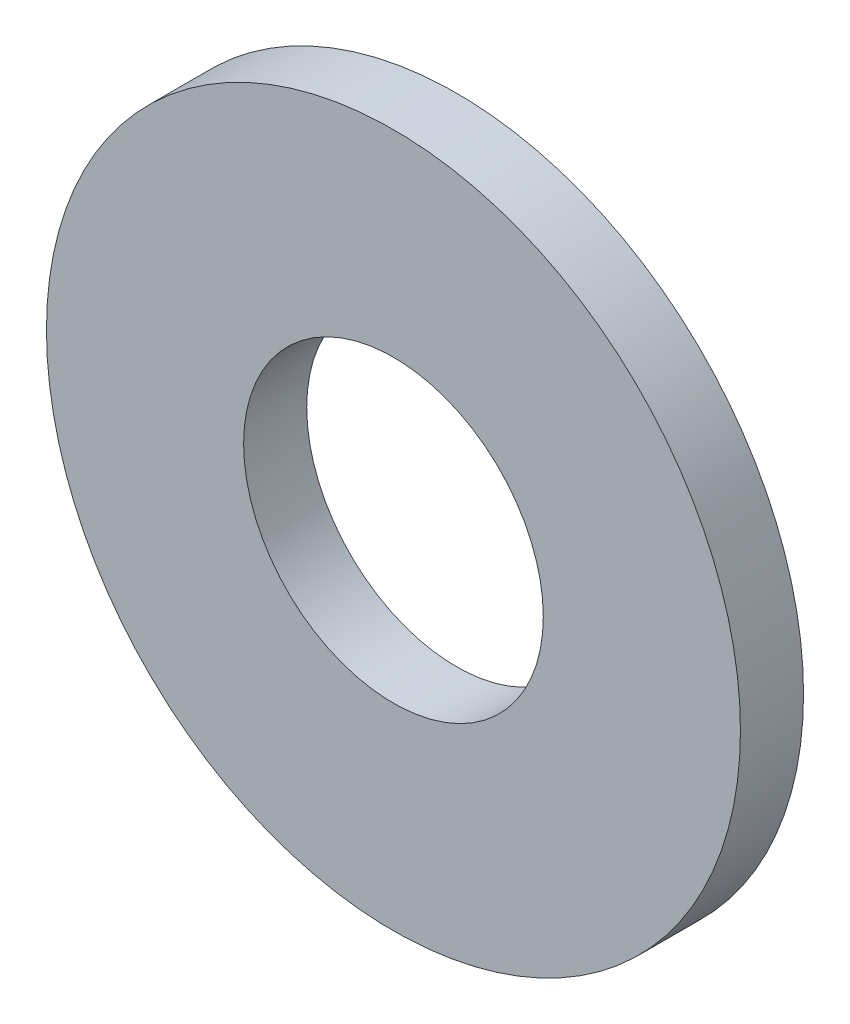
ISO-10303-21;
HEADER;
FILE_DESCRIPTION(('STEP AP214'),'2;1');
FILE_NAME('part.step','',(''),(''),'','','');
FILE_SCHEMA(('AUTOMOTIVE_DESIGN { 1 0 10303 214 1 1 1 1 }'));
ENDSEC;
DATA;
#1=APPLICATION_CONTEXT('core data for automotive mechanical design processes');
#2=APPLICATION_PROTOCOL_DEFINITION('international standard','automotive_design',2000,#1);
#3=PRODUCT_CONTEXT('',#1,'mechanical');
#4=PRODUCT('Part','Part','',(#3));
#5=PRODUCT_RELATED_PRODUCT_CATEGORY('part','',(#4));
#6=PRODUCT_DEFINITION_FORMATION('','',#4);
#7=PRODUCT_DEFINITION_CONTEXT('part definition',#1,'design');
#8=PRODUCT_DEFINITION('design','',#6,#7);
#9=PRODUCT_DEFINITION_SHAPE('','',#8);
#10=(LENGTH_UNIT() NAMED_UNIT(*) SI_UNIT(.MILLI.,.METRE.));
#11=(NAMED_UNIT(*) PLANE_ANGLE_UNIT() SI_UNIT($,.RADIAN.));
#12=(NAMED_UNIT(*) SI_UNIT($,.STERADIAN.) SOLID_ANGLE_UNIT());
#13=UNCERTAINTY_MEASURE_WITH_UNIT(LENGTH_MEASURE(1.E-05),#10,'distance_accuracy_value','');
#14=(GEOMETRIC_REPRESENTATION_CONTEXT(3) GLOBAL_UNCERTAINTY_ASSIGNED_CONTEXT((#13)) GLOBAL_UNIT_ASSIGNED_CONTEXT((#10,
#11,#12)) REPRESENTATION_CONTEXT('',''));
#15=CARTESIAN_POINT('',(0.,0.,0.));
#16=DIRECTION('',(0.,0.,1.));
#17=DIRECTION('',(1.,0.,0.));
#18=AXIS2_PLACEMENT_3D('',#15,#16,#17);
#19=CARTESIAN_POINT('',(0.,0.,0.508));
#20=DIRECTION('',(0.,0.,1.));
#21=DIRECTION('',(1.,0.,0.));
#22=AXIS2_PLACEMENT_3D('',#19,#20,#21);
#23=PLANE('',#22);
#24=CARTESIAN_POINT('',(0.,0.,0.508));
#25=DIRECTION('',(0.,0.,1.));
#26=DIRECTION('',(1.,0.,0.));
#27=AXIS2_PLACEMENT_3D('',#24,#25,#26);
#28=CIRCLE('',#27,5.588);
#29=CARTESIAN_POINT('',(5.588,0.,0.508));
#30=VERTEX_POINT('',#29);
#31=EDGE_CURVE('E10',#30,#30,#28,.T.);
#32=ORIENTED_EDGE('',*,*,#31,.T.);
#33=EDGE_LOOP('',(#32));
#34=FACE_BOUND('',#33,.T.);
#35=CARTESIAN_POINT('',(0.,0.,0.508));
#36=DIRECTION('',(0.,0.,1.));
#37=DIRECTION('',(1.,0.,0.));
#38=AXIS2_PLACEMENT_3D('',#35,#36,#37);
#39=CIRCLE('',#38,2.413);
#40=CARTESIAN_POINT('',(2.413,0.,0.508));
#41=VERTEX_POINT('',#40);
#42=EDGE_CURVE('E48',#41,#41,#39,.T.);
#43=ORIENTED_EDGE('',*,*,#42,.F.);
#44=EDGE_LOOP('',(#43));
#45=FACE_BOUND('',#44,.T.);
#46=ADVANCED_FACE('F41',(#34,#45),#23,.T.);
#47=CARTESIAN_POINT('',(0.,0.,0.508));
#48=DIRECTION('',(0.,0.,-1.));
#49=DIRECTION('',(-1.,0.,0.));
#50=AXIS2_PLACEMENT_3D('',#47,#48,#49);
#51=CYLINDRICAL_SURFACE('',#50,5.588);
#52=ORIENTED_EDGE('',*,*,#31,.F.);
#53=EDGE_LOOP('',(#52));
#54=FACE_BOUND('',#53,.T.);
#55=CARTESIAN_POINT('',(0.,0.,-0.508));
#56=DIRECTION('',(0.,0.,1.));
#57=DIRECTION('',(1.,0.,0.));
#58=AXIS2_PLACEMENT_3D('',#55,#56,#57);
#59=CIRCLE('',#58,5.588);
#60=CARTESIAN_POINT('',(5.588,0.,-0.508));
#61=VERTEX_POINT('',#60);
#62=EDGE_CURVE('E52',#61,#61,#59,.T.);
#63=ORIENTED_EDGE('',*,*,#62,.T.);
#64=EDGE_LOOP('',(#63));
#65=FACE_BOUND('',#64,.T.);
#66=ADVANCED_FACE('F43',(#54,#65),#51,.T.);
#67=CARTESIAN_POINT('',(0.,0.,0.508));
#68=DIRECTION('',(0.,0.,-1.));
#69=DIRECTION('',(-1.,0.,0.));
#70=AXIS2_PLACEMENT_3D('',#67,#68,#69);
#71=CYLINDRICAL_SURFACE('',#70,2.413);
#72=ORIENTED_EDGE('',*,*,#42,.T.);
#73=EDGE_LOOP('',(#72));
#74=FACE_BOUND('',#73,.T.);
#75=CARTESIAN_POINT('',(0.,0.,-0.508));
#76=DIRECTION('',(0.,0.,1.));
#77=DIRECTION('',(1.,0.,0.));
#78=AXIS2_PLACEMENT_3D('',#75,#76,#77);
#79=CIRCLE('',#78,2.413);
#80=CARTESIAN_POINT('',(2.413,0.,-0.508));
#81=VERTEX_POINT('',#80);
#82=EDGE_CURVE('E56',#81,#81,#79,.T.);
#83=ORIENTED_EDGE('',*,*,#82,.F.);
#84=EDGE_LOOP('',(#83));
#85=FACE_BOUND('',#84,.T.);
#86=ADVANCED_FACE('F65',(#74,#85),#71,.F.);
#87=CARTESIAN_POINT('',(0.,0.,-0.508));
#88=DIRECTION('',(0.,0.,1.));
#89=DIRECTION('',(1.,0.,0.));
#90=AXIS2_PLACEMENT_3D('',#87,#88,#89);
#91=PLANE('',#90);
#92=ORIENTED_EDGE('',*,*,#82,.T.);
#93=EDGE_LOOP('',(#92));
#94=FACE_BOUND('',#93,.T.);
#95=ORIENTED_EDGE('',*,*,#62,.F.);
#96=EDGE_LOOP('',(#95));
#97=FACE_BOUND('',#96,.T.);
#98=ADVANCED_FACE('F62',(#94,#97),#91,.F.);
#99=CLOSED_SHELL('',(#46,#66,#86,#98));
#100=MANIFOLD_SOLID_BREP('B2',#99);
#101=ADVANCED_BREP_SHAPE_REPRESENTATION('',(#18,#100),#14);
#102=SHAPE_DEFINITION_REPRESENTATION(#9,#101);
ENDSEC;
END-ISO-10303-21;
